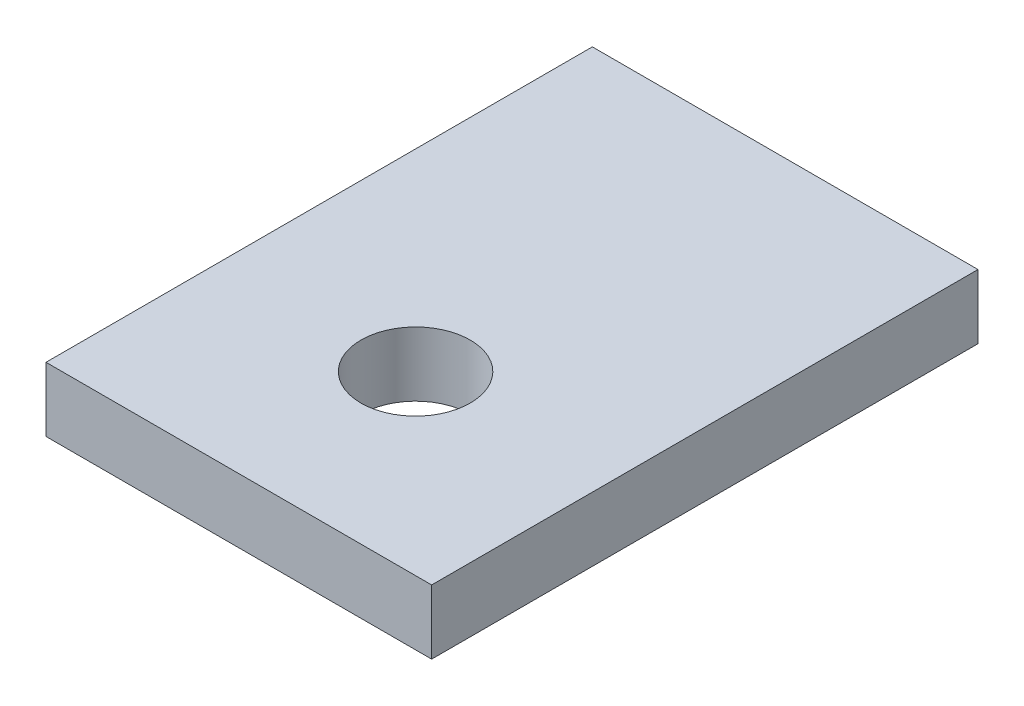
ISO-10303-21;
HEADER;
FILE_DESCRIPTION(('STEP AP214'),'2;1');
FILE_NAME('part.step','',(''),(''),'','','');
FILE_SCHEMA(('AUTOMOTIVE_DESIGN { 1 0 10303 214 1 1 1 1 }'));
ENDSEC;
DATA;
#1=APPLICATION_CONTEXT('core data for automotive mechanical design processes');
#2=APPLICATION_PROTOCOL_DEFINITION('international standard','automotive_design',2000,#1);
#3=PRODUCT_CONTEXT('',#1,'mechanical');
#4=PRODUCT('Part','Part','',(#3));
#5=PRODUCT_RELATED_PRODUCT_CATEGORY('part','',(#4));
#6=PRODUCT_DEFINITION_FORMATION('','',#4);
#7=PRODUCT_DEFINITION_CONTEXT('part definition',#1,'design');
#8=PRODUCT_DEFINITION('design','',#6,#7);
#9=PRODUCT_DEFINITION_SHAPE('','',#8);
#10=(LENGTH_UNIT() NAMED_UNIT(*) SI_UNIT(.MILLI.,.METRE.));
#11=(NAMED_UNIT(*) PLANE_ANGLE_UNIT() SI_UNIT($,.RADIAN.));
#12=(NAMED_UNIT(*) SI_UNIT($,.STERADIAN.) SOLID_ANGLE_UNIT());
#13=UNCERTAINTY_MEASURE_WITH_UNIT(LENGTH_MEASURE(1.E-05),#10,'distance_accuracy_value','');
#14=(GEOMETRIC_REPRESENTATION_CONTEXT(3) GLOBAL_UNCERTAINTY_ASSIGNED_CONTEXT((#13)) GLOBAL_UNIT_ASSIGNED_CONTEXT((#10,
#11,#12)) REPRESENTATION_CONTEXT('',''));
#15=CARTESIAN_POINT('',(0.,0.,0.));
#16=DIRECTION('',(0.,0.,1.));
#17=DIRECTION('',(1.,0.,0.));
#18=AXIS2_PLACEMENT_3D('',#15,#16,#17);
#19=CARTESIAN_POINT('',(0.,59.,114.5));
#20=DIRECTION('',(0.,1.,0.));
#21=DIRECTION('',(0.,0.,1.));
#22=AXIS2_PLACEMENT_3D('',#19,#20,#21);
#23=CYLINDRICAL_SURFACE('',#22,1.7);
#24=DIRECTION('',(0.,1.,0.));
#25=VECTOR('',#24,1.);
#26=CARTESIAN_POINT('',(0.,59.,116.2));
#27=LINE('',#26,#25);
#28=CARTESIAN_POINT('',(0.,59.75,116.2));
#29=VERTEX_POINT('',#28);
#30=CARTESIAN_POINT('',(0.,61.75,116.2));
#31=VERTEX_POINT('',#30);
#32=EDGE_CURVE('E11',#29,#31,#27,.T.);
#33=ORIENTED_EDGE('',*,*,#32,.F.);
#34=CARTESIAN_POINT('',(0.,59.75,114.5));
#35=DIRECTION('',(0.,1.,0.));
#36=DIRECTION('',(0.,0.,1.));
#37=AXIS2_PLACEMENT_3D('',#34,#35,#36);
#38=CIRCLE('',#37,1.7);
#39=EDGE_CURVE('E112',#29,#29,#38,.T.);
#40=ORIENTED_EDGE('',*,*,#39,.F.);
#41=ORIENTED_EDGE('',*,*,#32,.T.);
#42=CARTESIAN_POINT('',(0.,61.75,114.5));
#43=DIRECTION('',(0.,1.,0.));
#44=DIRECTION('',(0.,0.,1.));
#45=AXIS2_PLACEMENT_3D('',#42,#43,#44);
#46=CIRCLE('',#45,1.7);
#47=EDGE_CURVE('E20',#31,#31,#46,.T.);
#48=ORIENTED_EDGE('',*,*,#47,.T.);
#49=EDGE_LOOP('',(#33,#40,#41,#48));
#50=FACE_BOUND('',#49,.T.);
#51=ADVANCED_FACE('F17',(#50),#23,.F.);
#52=CARTESIAN_POINT('',(6.,59.75,103.));
#53=DIRECTION('',(1.,0.,0.));
#54=DIRECTION('',(0.,1.,0.));
#55=AXIS2_PLACEMENT_3D('',#52,#53,#54);
#56=PLANE('',#55);
#57=DIRECTION('',(0.,0.,1.));
#58=VECTOR('',#57,1.);
#59=CARTESIAN_POINT('',(6.,59.75,103.));
#60=LINE('',#59,#58);
#61=CARTESIAN_POINT('',(6.,59.75,103.));
#62=VERTEX_POINT('',#61);
#63=CARTESIAN_POINT('',(6.,59.75,120.));
#64=VERTEX_POINT('',#63);
#65=EDGE_CURVE('E81',#62,#64,#60,.T.);
#66=ORIENTED_EDGE('',*,*,#65,.F.);
#67=DIRECTION('',(0.,1.,0.));
#68=VECTOR('',#67,1.);
#69=CARTESIAN_POINT('',(6.,59.75,103.));
#70=LINE('',#69,#68);
#71=CARTESIAN_POINT('',(6.,61.75,103.));
#72=VERTEX_POINT('',#71);
#73=EDGE_CURVE('E27',#62,#72,#70,.T.);
#74=ORIENTED_EDGE('',*,*,#73,.T.);
#75=DIRECTION('',(0.,0.,1.));
#76=VECTOR('',#75,1.);
#77=CARTESIAN_POINT('',(6.,61.75,103.));
#78=LINE('',#77,#76);
#79=CARTESIAN_POINT('',(6.,61.75,120.));
#80=VERTEX_POINT('',#79);
#81=EDGE_CURVE('E114',#72,#80,#78,.T.);
#82=ORIENTED_EDGE('',*,*,#81,.T.);
#83=DIRECTION('',(0.,1.,0.));
#84=VECTOR('',#83,1.);
#85=CARTESIAN_POINT('',(6.,59.75,120.));
#86=LINE('',#85,#84);
#87=EDGE_CURVE('E111',#64,#80,#86,.T.);
#88=ORIENTED_EDGE('',*,*,#87,.F.);
#89=EDGE_LOOP('',(#66,#74,#82,#88));
#90=FACE_BOUND('',#89,.T.);
#91=ADVANCED_FACE('F138',(#90),#56,.T.);
#92=CARTESIAN_POINT('',(-6.,59.75,103.));
#93=DIRECTION('',(0.,0.,1.));
#94=DIRECTION('',(1.,0.,0.));
#95=AXIS2_PLACEMENT_3D('',#92,#93,#94);
#96=PLANE('',#95);
#97=DIRECTION('',(1.,0.,0.));
#98=VECTOR('',#97,1.);
#99=CARTESIAN_POINT('',(-6.,61.75,103.));
#100=LINE('',#99,#98);
#101=CARTESIAN_POINT('',(-6.,61.75,103.));
#102=VERTEX_POINT('',#101);
#103=EDGE_CURVE('E117',#102,#72,#100,.T.);
#104=ORIENTED_EDGE('',*,*,#103,.T.);
#105=ORIENTED_EDGE('',*,*,#73,.F.);
#106=DIRECTION('',(1.,0.,0.));
#107=VECTOR('',#106,1.);
#108=CARTESIAN_POINT('',(-6.,59.75,103.));
#109=LINE('',#108,#107);
#110=CARTESIAN_POINT('',(-6.,59.75,103.));
#111=VERTEX_POINT('',#110);
#112=EDGE_CURVE('E86',#111,#62,#109,.T.);
#113=ORIENTED_EDGE('',*,*,#112,.F.);
#114=DIRECTION('',(0.,1.,0.));
#115=VECTOR('',#114,1.);
#116=CARTESIAN_POINT('',(-6.,59.75,103.));
#117=LINE('',#116,#115);
#118=EDGE_CURVE('E94',#111,#102,#117,.T.);
#119=ORIENTED_EDGE('',*,*,#118,.T.);
#120=EDGE_LOOP('',(#104,#105,#113,#119));
#121=FACE_BOUND('',#120,.T.);
#122=ADVANCED_FACE('F133',(#121),#96,.F.);
#123=CARTESIAN_POINT('',(-6.,61.75,103.));
#124=DIRECTION('',(0.,1.,0.));
#125=DIRECTION('',(1.,0.,0.));
#126=AXIS2_PLACEMENT_3D('',#123,#124,#125);
#127=PLANE('',#126);
#128=ORIENTED_EDGE('',*,*,#47,.F.);
#129=EDGE_LOOP('',(#128));
#130=FACE_BOUND('',#129,.T.);
#131=ORIENTED_EDGE('',*,*,#103,.F.);
#132=DIRECTION('',(0.,0.,1.));
#133=VECTOR('',#132,1.);
#134=CARTESIAN_POINT('',(-6.,61.75,103.));
#135=LINE('',#134,#133);
#136=CARTESIAN_POINT('',(-6.,61.75,120.));
#137=VERTEX_POINT('',#136);
#138=EDGE_CURVE('E102',#102,#137,#135,.T.);
#139=ORIENTED_EDGE('',*,*,#138,.T.);
#140=DIRECTION('',(1.,0.,0.));
#141=VECTOR('',#140,1.);
#142=CARTESIAN_POINT('',(-6.,61.75,120.));
#143=LINE('',#142,#141);
#144=EDGE_CURVE('E99',#137,#80,#143,.T.);
#145=ORIENTED_EDGE('',*,*,#144,.T.);
#146=ORIENTED_EDGE('',*,*,#81,.F.);
#147=EDGE_LOOP('',(#131,#139,#145,#146));
#148=FACE_BOUND('',#147,.T.);
#149=ADVANCED_FACE('F136',(#130,#148),#127,.T.);
#150=CARTESIAN_POINT('',(-6.,59.75,120.));
#151=DIRECTION('',(0.,0.,1.));
#152=DIRECTION('',(1.,0.,0.));
#153=AXIS2_PLACEMENT_3D('',#150,#151,#152);
#154=PLANE('',#153);
#155=DIRECTION('',(0.,1.,0.));
#156=VECTOR('',#155,1.);
#157=CARTESIAN_POINT('',(-6.,59.75,120.));
#158=LINE('',#157,#156);
#159=CARTESIAN_POINT('',(-6.,59.75,120.));
#160=VERTEX_POINT('',#159);
#161=EDGE_CURVE('E92',#160,#137,#158,.T.);
#162=ORIENTED_EDGE('',*,*,#161,.F.);
#163=DIRECTION('',(1.,0.,0.));
#164=VECTOR('',#163,1.);
#165=CARTESIAN_POINT('',(-6.,59.75,120.));
#166=LINE('',#165,#164);
#167=EDGE_CURVE('E74',#160,#64,#166,.T.);
#168=ORIENTED_EDGE('',*,*,#167,.T.);
#169=ORIENTED_EDGE('',*,*,#87,.T.);
#170=ORIENTED_EDGE('',*,*,#144,.F.);
#171=EDGE_LOOP('',(#162,#168,#169,#170));
#172=FACE_BOUND('',#171,.T.);
#173=ADVANCED_FACE('F97',(#172),#154,.T.);
#174=CARTESIAN_POINT('',(-6.,59.75,103.));
#175=DIRECTION('',(0.,1.,0.));
#176=DIRECTION('',(1.,0.,0.));
#177=AXIS2_PLACEMENT_3D('',#174,#175,#176);
#178=PLANE('',#177);
#179=ORIENTED_EDGE('',*,*,#39,.T.);
#180=EDGE_LOOP('',(#179));
#181=FACE_BOUND('',#180,.T.);
#182=ORIENTED_EDGE('',*,*,#65,.T.);
#183=ORIENTED_EDGE('',*,*,#167,.F.);
#184=DIRECTION('',(0.,0.,1.));
#185=VECTOR('',#184,1.);
#186=CARTESIAN_POINT('',(-6.,59.75,103.));
#187=LINE('',#186,#185);
#188=EDGE_CURVE('E78',#111,#160,#187,.T.);
#189=ORIENTED_EDGE('',*,*,#188,.F.);
#190=ORIENTED_EDGE('',*,*,#112,.T.);
#191=EDGE_LOOP('',(#182,#183,#189,#190));
#192=FACE_BOUND('',#191,.T.);
#193=ADVANCED_FACE('F76',(#181,#192),#178,.F.);
#194=CARTESIAN_POINT('',(-6.,59.75,103.));
#195=DIRECTION('',(1.,0.,0.));
#196=DIRECTION('',(0.,1.,0.));
#197=AXIS2_PLACEMENT_3D('',#194,#195,#196);
#198=PLANE('',#197);
#199=ORIENTED_EDGE('',*,*,#161,.T.);
#200=ORIENTED_EDGE('',*,*,#138,.F.);
#201=ORIENTED_EDGE('',*,*,#118,.F.);
#202=ORIENTED_EDGE('',*,*,#188,.T.);
#203=EDGE_LOOP('',(#199,#200,#201,#202));
#204=FACE_BOUND('',#203,.T.);
#205=ADVANCED_FACE('F90',(#204),#198,.F.);
#206=CLOSED_SHELL('',(#51,#91,#122,#149,#173,#193,#205));
#207=MANIFOLD_SOLID_BREP('B1',#206);
#208=ADVANCED_BREP_SHAPE_REPRESENTATION('',(#18,#207),#14);
#209=SHAPE_DEFINITION_REPRESENTATION(#9,#208);
ENDSEC;
END-ISO-10303-21;
